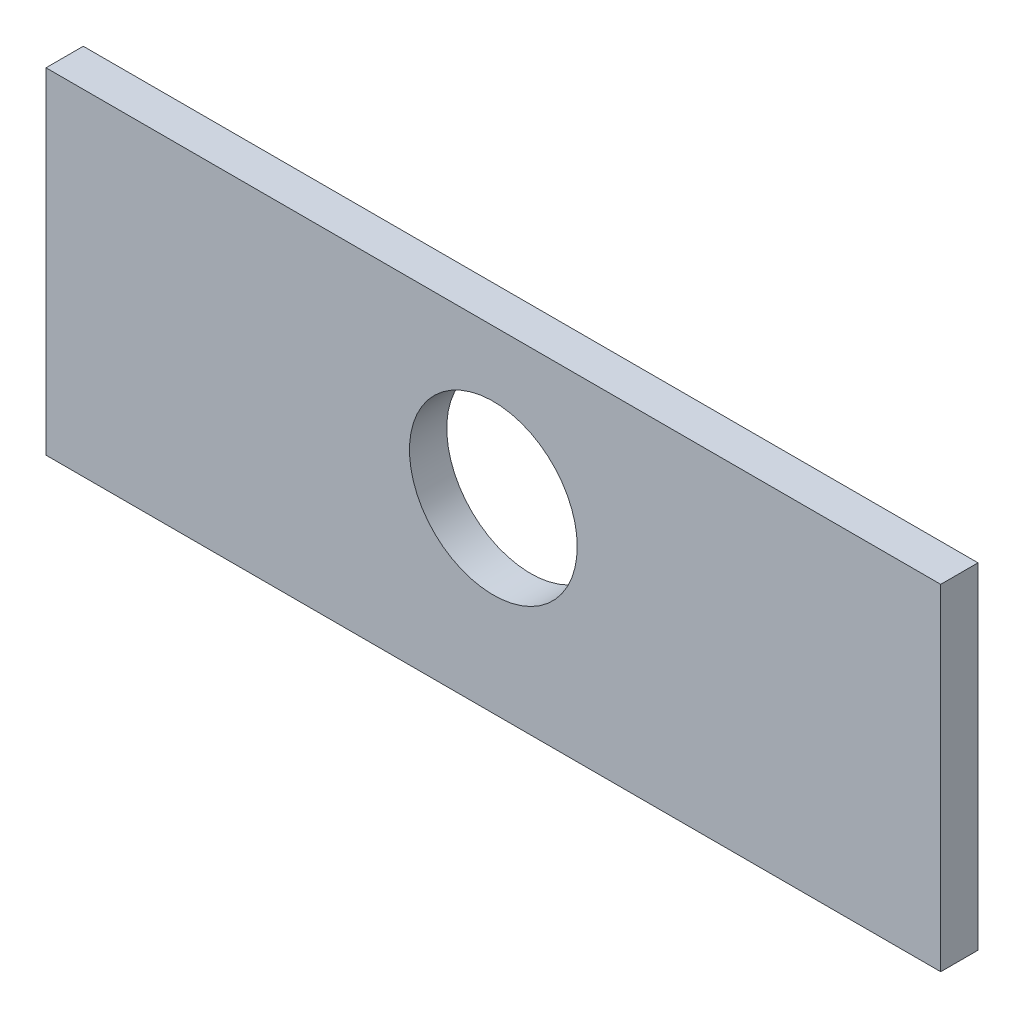
ISO-10303-21;
HEADER;
FILE_DESCRIPTION(('STEP AP214'),'2;1');
FILE_NAME('part.step','',(''),(''),'','','');
FILE_SCHEMA(('AUTOMOTIVE_DESIGN { 1 0 10303 214 1 1 1 1 }'));
ENDSEC;
DATA;
#1=APPLICATION_CONTEXT('core data for automotive mechanical design processes');
#2=APPLICATION_PROTOCOL_DEFINITION('international standard','automotive_design',2000,#1);
#3=PRODUCT_CONTEXT('',#1,'mechanical');
#4=PRODUCT('Part','Part','',(#3));
#5=PRODUCT_RELATED_PRODUCT_CATEGORY('part','',(#4));
#6=PRODUCT_DEFINITION_FORMATION('','',#4);
#7=PRODUCT_DEFINITION_CONTEXT('part definition',#1,'design');
#8=PRODUCT_DEFINITION('design','',#6,#7);
#9=PRODUCT_DEFINITION_SHAPE('','',#8);
#10=(LENGTH_UNIT() NAMED_UNIT(*) SI_UNIT(.MILLI.,.METRE.));
#11=(NAMED_UNIT(*) PLANE_ANGLE_UNIT() SI_UNIT($,.RADIAN.));
#12=(NAMED_UNIT(*) SI_UNIT($,.STERADIAN.) SOLID_ANGLE_UNIT());
#13=UNCERTAINTY_MEASURE_WITH_UNIT(LENGTH_MEASURE(1.E-05),#10,'distance_accuracy_value','');
#14=(GEOMETRIC_REPRESENTATION_CONTEXT(3) GLOBAL_UNCERTAINTY_ASSIGNED_CONTEXT((#13)) GLOBAL_UNIT_ASSIGNED_CONTEXT((#10,
#11,#12)) REPRESENTATION_CONTEXT('',''));
#15=CARTESIAN_POINT('',(0.,0.,0.));
#16=DIRECTION('',(0.,0.,1.));
#17=DIRECTION('',(1.,0.,0.));
#18=AXIS2_PLACEMENT_3D('',#15,#16,#17);
#19=CARTESIAN_POINT('',(0.,0.,10.));
#20=DIRECTION('',(0.,0.,-1.));
#21=DIRECTION('',(-1.,0.,0.));
#22=AXIS2_PLACEMENT_3D('',#19,#20,#21);
#23=PLANE('',#22);
#24=DIRECTION('',(0.,-1.,0.));
#25=VECTOR('',#24,1.);
#26=CARTESIAN_POINT('',(0.,0.,10.));
#27=LINE('',#26,#25);
#28=CARTESIAN_POINT('',(0.,90.,10.));
#29=VERTEX_POINT('',#28);
#30=CARTESIAN_POINT('',(0.,0.,10.));
#31=VERTEX_POINT('',#30);
#32=EDGE_CURVE('E98',#29,#31,#27,.T.);
#33=ORIENTED_EDGE('',*,*,#32,.T.);
#34=DIRECTION('',(1.,0.,0.));
#35=VECTOR('',#34,1.);
#36=CARTESIAN_POINT('',(0.,0.,10.));
#37=LINE('',#36,#35);
#38=CARTESIAN_POINT('',(240.,0.,10.));
#39=VERTEX_POINT('',#38);
#40=EDGE_CURVE('E93',#31,#39,#37,.T.);
#41=ORIENTED_EDGE('',*,*,#40,.T.);
#42=DIRECTION('',(0.,1.,0.));
#43=VECTOR('',#42,1.);
#44=CARTESIAN_POINT('',(240.,0.,10.));
#45=LINE('',#44,#43);
#46=CARTESIAN_POINT('',(240.,90.,10.));
#47=VERTEX_POINT('',#46);
#48=EDGE_CURVE('E96',#39,#47,#45,.T.);
#49=ORIENTED_EDGE('',*,*,#48,.T.);
#50=DIRECTION('',(-1.,0.,0.));
#51=VECTOR('',#50,1.);
#52=CARTESIAN_POINT('',(0.,90.,10.));
#53=LINE('',#52,#51);
#54=EDGE_CURVE('E63',#47,#29,#53,.T.);
#55=ORIENTED_EDGE('',*,*,#54,.T.);
#56=EDGE_LOOP('',(#33,#41,#49,#55));
#57=FACE_BOUND('',#56,.T.);
#58=CARTESIAN_POINT('',(120.,50.,10.));
#59=DIRECTION('',(0.,0.,1.));
#60=DIRECTION('',(1.,0.,0.));
#61=AXIS2_PLACEMENT_3D('',#58,#59,#60);
#62=CIRCLE('',#61,22.5);
#63=CARTESIAN_POINT('',(142.5,50.,10.));
#64=VERTEX_POINT('',#63);
#65=EDGE_CURVE('E118',#64,#64,#62,.T.);
#66=ORIENTED_EDGE('',*,*,#65,.F.);
#67=EDGE_LOOP('',(#66));
#68=FACE_BOUND('',#67,.T.);
#69=ADVANCED_FACE('F45',(#57,#68),#23,.F.);
#70=CARTESIAN_POINT('',(0.,0.,0.));
#71=DIRECTION('',(0.,0.,-1.));
#72=DIRECTION('',(-1.,0.,0.));
#73=AXIS2_PLACEMENT_3D('',#70,#71,#72);
#74=PLANE('',#73);
#75=DIRECTION('',(0.,-1.,0.));
#76=VECTOR('',#75,1.);
#77=CARTESIAN_POINT('',(0.,0.,0.));
#78=LINE('',#77,#76);
#79=CARTESIAN_POINT('',(0.,90.,0.));
#80=VERTEX_POINT('',#79);
#81=CARTESIAN_POINT('',(0.,0.,0.));
#82=VERTEX_POINT('',#81);
#83=EDGE_CURVE('E114',#80,#82,#78,.T.);
#84=ORIENTED_EDGE('',*,*,#83,.F.);
#85=DIRECTION('',(-1.,0.,0.));
#86=VECTOR('',#85,1.);
#87=CARTESIAN_POINT('',(0.,90.,0.));
#88=LINE('',#87,#86);
#89=CARTESIAN_POINT('',(240.,90.,0.));
#90=VERTEX_POINT('',#89);
#91=EDGE_CURVE('E86',#90,#80,#88,.T.);
#92=ORIENTED_EDGE('',*,*,#91,.F.);
#93=DIRECTION('',(0.,1.,0.));
#94=VECTOR('',#93,1.);
#95=CARTESIAN_POINT('',(240.,0.,0.));
#96=LINE('',#95,#94);
#97=CARTESIAN_POINT('',(240.,0.,0.));
#98=VERTEX_POINT('',#97);
#99=EDGE_CURVE('E80',#98,#90,#96,.T.);
#100=ORIENTED_EDGE('',*,*,#99,.F.);
#101=DIRECTION('',(1.,0.,0.));
#102=VECTOR('',#101,1.);
#103=CARTESIAN_POINT('',(0.,0.,0.));
#104=LINE('',#103,#102);
#105=EDGE_CURVE('E103',#82,#98,#104,.T.);
#106=ORIENTED_EDGE('',*,*,#105,.F.);
#107=EDGE_LOOP('',(#84,#92,#100,#106));
#108=FACE_BOUND('',#107,.T.);
#109=CARTESIAN_POINT('',(120.,50.,0.));
#110=DIRECTION('',(0.,0.,1.));
#111=DIRECTION('',(1.,0.,0.));
#112=AXIS2_PLACEMENT_3D('',#109,#110,#111);
#113=CIRCLE('',#112,22.5);
#114=CARTESIAN_POINT('',(142.5,50.,0.));
#115=VERTEX_POINT('',#114);
#116=EDGE_CURVE('E136',#115,#115,#113,.T.);
#117=ORIENTED_EDGE('',*,*,#116,.T.);
#118=EDGE_LOOP('',(#117));
#119=FACE_BOUND('',#118,.T.);
#120=ADVANCED_FACE('F131',(#108,#119),#74,.T.);
#121=CARTESIAN_POINT('',(0.,0.,10.));
#122=DIRECTION('',(1.,0.,0.));
#123=DIRECTION('',(0.,0.,-1.));
#124=AXIS2_PLACEMENT_3D('',#121,#122,#123);
#125=PLANE('',#124);
#126=ORIENTED_EDGE('',*,*,#83,.T.);
#127=DIRECTION('',(0.,0.,-1.));
#128=VECTOR('',#127,1.);
#129=CARTESIAN_POINT('',(0.,0.,10.));
#130=LINE('',#129,#128);
#131=EDGE_CURVE('E11',#31,#82,#130,.T.);
#132=ORIENTED_EDGE('',*,*,#131,.F.);
#133=ORIENTED_EDGE('',*,*,#32,.F.);
#134=DIRECTION('',(0.,0.,-1.));
#135=VECTOR('',#134,1.);
#136=CARTESIAN_POINT('',(0.,90.,10.));
#137=LINE('',#136,#135);
#138=EDGE_CURVE('E110',#29,#80,#137,.T.);
#139=ORIENTED_EDGE('',*,*,#138,.T.);
#140=EDGE_LOOP('',(#126,#132,#133,#139));
#141=FACE_BOUND('',#140,.T.);
#142=ADVANCED_FACE('F47',(#141),#125,.F.);
#143=CARTESIAN_POINT('',(0.,0.,10.));
#144=DIRECTION('',(0.,1.,0.));
#145=DIRECTION('',(0.,0.,1.));
#146=AXIS2_PLACEMENT_3D('',#143,#144,#145);
#147=PLANE('',#146);
#148=ORIENTED_EDGE('',*,*,#105,.T.);
#149=DIRECTION('',(0.,0.,-1.));
#150=VECTOR('',#149,1.);
#151=CARTESIAN_POINT('',(240.,0.,10.));
#152=LINE('',#151,#150);
#153=EDGE_CURVE('E55',#39,#98,#152,.T.);
#154=ORIENTED_EDGE('',*,*,#153,.F.);
#155=ORIENTED_EDGE('',*,*,#40,.F.);
#156=ORIENTED_EDGE('',*,*,#131,.T.);
#157=EDGE_LOOP('',(#148,#154,#155,#156));
#158=FACE_BOUND('',#157,.T.);
#159=ADVANCED_FACE('F102',(#158),#147,.F.);
#160=CARTESIAN_POINT('',(240.,0.,10.));
#161=DIRECTION('',(-1.,0.,0.));
#162=DIRECTION('',(0.,0.,1.));
#163=AXIS2_PLACEMENT_3D('',#160,#161,#162);
#164=PLANE('',#163);
#165=ORIENTED_EDGE('',*,*,#99,.T.);
#166=DIRECTION('',(0.,0.,-1.));
#167=VECTOR('',#166,1.);
#168=CARTESIAN_POINT('',(240.,90.,10.));
#169=LINE('',#168,#167);
#170=EDGE_CURVE('E105',#47,#90,#169,.T.);
#171=ORIENTED_EDGE('',*,*,#170,.F.);
#172=ORIENTED_EDGE('',*,*,#48,.F.);
#173=ORIENTED_EDGE('',*,*,#153,.T.);
#174=EDGE_LOOP('',(#165,#171,#172,#173));
#175=FACE_BOUND('',#174,.T.);
#176=ADVANCED_FACE('F106',(#175),#164,.F.);
#177=CARTESIAN_POINT('',(0.,90.,10.));
#178=DIRECTION('',(0.,-1.,0.));
#179=DIRECTION('',(0.,0.,-1.));
#180=AXIS2_PLACEMENT_3D('',#177,#178,#179);
#181=PLANE('',#180);
#182=ORIENTED_EDGE('',*,*,#91,.T.);
#183=ORIENTED_EDGE('',*,*,#138,.F.);
#184=ORIENTED_EDGE('',*,*,#54,.F.);
#185=ORIENTED_EDGE('',*,*,#170,.T.);
#186=EDGE_LOOP('',(#182,#183,#184,#185));
#187=FACE_BOUND('',#186,.T.);
#188=ADVANCED_FACE('F128',(#187),#181,.F.);
#189=CARTESIAN_POINT('',(120.,50.,10.));
#190=DIRECTION('',(0.,0.,-1.));
#191=DIRECTION('',(-1.,0.,0.));
#192=AXIS2_PLACEMENT_3D('',#189,#190,#191);
#193=CYLINDRICAL_SURFACE('',#192,22.5);
#194=ORIENTED_EDGE('',*,*,#65,.T.);
#195=EDGE_LOOP('',(#194));
#196=FACE_BOUND('',#195,.T.);
#197=ORIENTED_EDGE('',*,*,#116,.F.);
#198=EDGE_LOOP('',(#197));
#199=FACE_BOUND('',#198,.T.);
#200=ADVANCED_FACE('F144',(#196,#199),#193,.F.);
#201=CLOSED_SHELL('',(#69,#120,#142,#159,#176,#188,#200));
#202=MANIFOLD_SOLID_BREP('B2',#201);
#203=ADVANCED_BREP_SHAPE_REPRESENTATION('',(#18,#202),#14);
#204=SHAPE_DEFINITION_REPRESENTATION(#9,#203);
ENDSEC;
END-ISO-10303-21;
